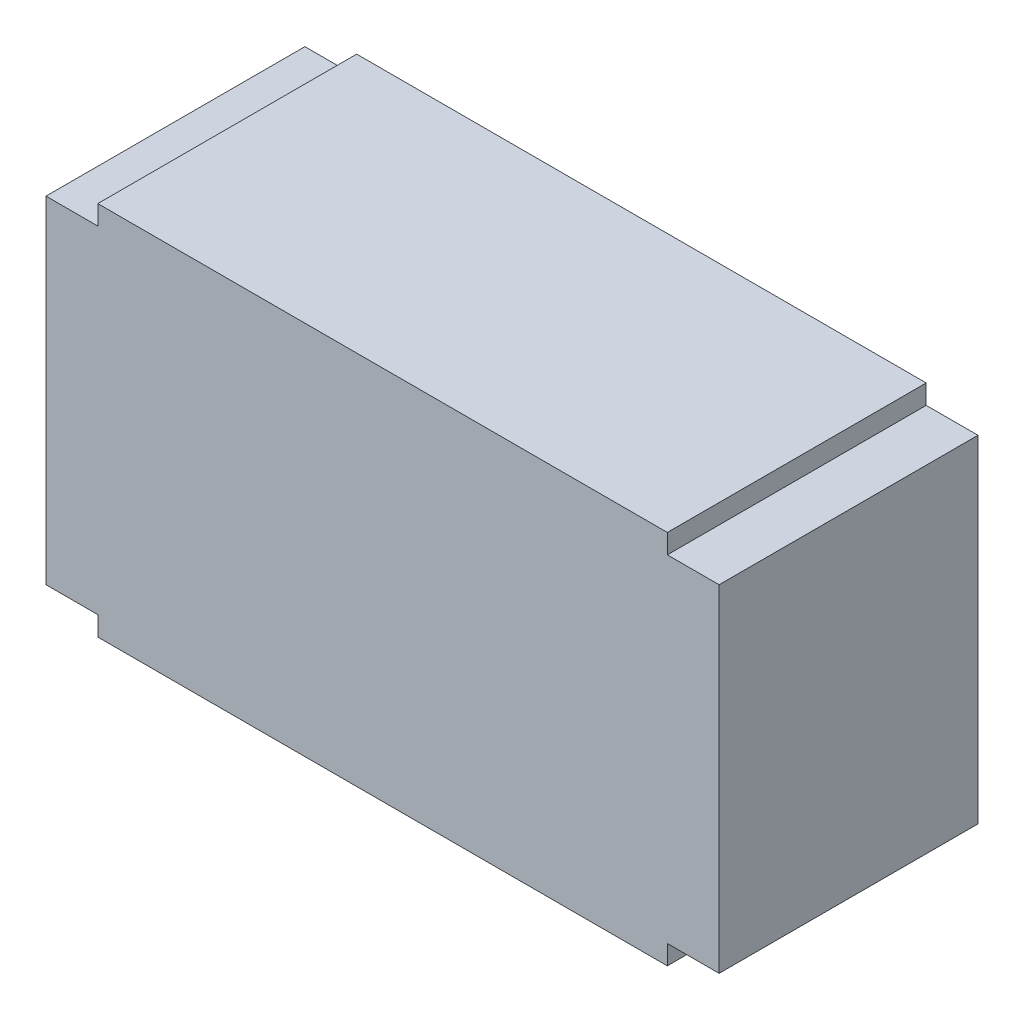
ISO-10303-21;
HEADER;
FILE_DESCRIPTION(('STEP AP214'),'2;1');
FILE_NAME('part.step','',(''),(''),'','','');
FILE_SCHEMA(('AUTOMOTIVE_DESIGN { 1 0 10303 214 1 1 1 1 }'));
ENDSEC;
DATA;
#1=APPLICATION_CONTEXT('core data for automotive mechanical design processes');
#2=APPLICATION_PROTOCOL_DEFINITION('international standard','automotive_design',2000,#1);
#3=PRODUCT_CONTEXT('',#1,'mechanical');
#4=PRODUCT('Part','Part','',(#3));
#5=PRODUCT_RELATED_PRODUCT_CATEGORY('part','',(#4));
#6=PRODUCT_DEFINITION_FORMATION('','',#4);
#7=PRODUCT_DEFINITION_CONTEXT('part definition',#1,'design');
#8=PRODUCT_DEFINITION('design','',#6,#7);
#9=PRODUCT_DEFINITION_SHAPE('','',#8);
#10=(LENGTH_UNIT() NAMED_UNIT(*) SI_UNIT(.MILLI.,.METRE.));
#11=(NAMED_UNIT(*) PLANE_ANGLE_UNIT() SI_UNIT($,.RADIAN.));
#12=(NAMED_UNIT(*) SI_UNIT($,.STERADIAN.) SOLID_ANGLE_UNIT());
#13=UNCERTAINTY_MEASURE_WITH_UNIT(LENGTH_MEASURE(1.E-05),#10,'distance_accuracy_value','');
#14=(GEOMETRIC_REPRESENTATION_CONTEXT(3) GLOBAL_UNCERTAINTY_ASSIGNED_CONTEXT((#13)) GLOBAL_UNIT_ASSIGNED_CONTEXT((#10,
#11,#12)) REPRESENTATION_CONTEXT('',''));
#15=CARTESIAN_POINT('',(0.,0.,0.));
#16=DIRECTION('',(0.,0.,1.));
#17=DIRECTION('',(1.,0.,0.));
#18=AXIS2_PLACEMENT_3D('',#15,#16,#17);
#19=CARTESIAN_POINT('',(-1.3,-0.65,1.));
#20=DIRECTION('',(1.,0.,0.));
#21=DIRECTION('',(0.,0.,-1.));
#22=AXIS2_PLACEMENT_3D('',#19,#20,#21);
#23=PLANE('',#22);
#24=DIRECTION('',(0.,-1.,0.));
#25=VECTOR('',#24,1.);
#26=CARTESIAN_POINT('',(-1.3,-0.65,0.));
#27=LINE('',#26,#25);
#28=CARTESIAN_POINT('',(-1.3,0.65,0.));
#29=VERTEX_POINT('',#28);
#30=CARTESIAN_POINT('',(-1.3,-0.65,0.));
#31=VERTEX_POINT('',#30);
#32=EDGE_CURVE('E154',#29,#31,#27,.T.);
#33=ORIENTED_EDGE('',*,*,#32,.T.);
#34=DIRECTION('',(0.,0.,-1.));
#35=VECTOR('',#34,1.);
#36=CARTESIAN_POINT('',(-1.3,-0.65,1.));
#37=LINE('',#36,#35);
#38=CARTESIAN_POINT('',(-1.3,-0.65,1.));
#39=VERTEX_POINT('',#38);
#40=EDGE_CURVE('E11',#39,#31,#37,.T.);
#41=ORIENTED_EDGE('',*,*,#40,.F.);
#42=DIRECTION('',(0.,-1.,0.));
#43=VECTOR('',#42,1.);
#44=CARTESIAN_POINT('',(-1.3,-0.65,1.));
#45=LINE('',#44,#43);
#46=CARTESIAN_POINT('',(-1.3,0.65,1.));
#47=VERTEX_POINT('',#46);
#48=EDGE_CURVE('E176',#47,#39,#45,.T.);
#49=ORIENTED_EDGE('',*,*,#48,.F.);
#50=DIRECTION('',(0.,0.,-1.));
#51=VECTOR('',#50,1.);
#52=CARTESIAN_POINT('',(-1.3,0.65,1.));
#53=LINE('',#52,#51);
#54=EDGE_CURVE('E150',#47,#29,#53,.T.);
#55=ORIENTED_EDGE('',*,*,#54,.T.);
#56=EDGE_LOOP('',(#33,#41,#49,#55));
#57=FACE_BOUND('',#56,.T.);
#58=ADVANCED_FACE('F34',(#57),#23,.F.);
#59=CARTESIAN_POINT('',(-1.1,-0.65,1.));
#60=DIRECTION('',(0.,1.,0.));
#61=DIRECTION('',(0.,0.,1.));
#62=AXIS2_PLACEMENT_3D('',#59,#60,#61);
#63=PLANE('',#62);
#64=DIRECTION('',(1.,0.,0.));
#65=VECTOR('',#64,1.);
#66=CARTESIAN_POINT('',(-1.1,-0.65,0.));
#67=LINE('',#66,#65);
#68=CARTESIAN_POINT('',(-1.1,-0.65,0.));
#69=VERTEX_POINT('',#68);
#70=EDGE_CURVE('E157',#31,#69,#67,.T.);
#71=ORIENTED_EDGE('',*,*,#70,.T.);
#72=DIRECTION('',(0.,0.,-1.));
#73=VECTOR('',#72,1.);
#74=CARTESIAN_POINT('',(-1.1,-0.65,1.));
#75=LINE('',#74,#73);
#76=CARTESIAN_POINT('',(-1.1,-0.65,1.));
#77=VERTEX_POINT('',#76);
#78=EDGE_CURVE('E42',#77,#69,#75,.T.);
#79=ORIENTED_EDGE('',*,*,#78,.F.);
#80=DIRECTION('',(1.,0.,0.));
#81=VECTOR('',#80,1.);
#82=CARTESIAN_POINT('',(-1.1,-0.65,1.));
#83=LINE('',#82,#81);
#84=EDGE_CURVE('E105',#39,#77,#83,.T.);
#85=ORIENTED_EDGE('',*,*,#84,.F.);
#86=ORIENTED_EDGE('',*,*,#40,.T.);
#87=EDGE_LOOP('',(#71,#79,#85,#86));
#88=FACE_BOUND('',#87,.T.);
#89=ADVANCED_FACE('F254',(#88),#63,.F.);
#90=CARTESIAN_POINT('',(-1.1,-0.725,1.));
#91=DIRECTION('',(1.,0.,0.));
#92=DIRECTION('',(0.,0.,-1.));
#93=AXIS2_PLACEMENT_3D('',#90,#91,#92);
#94=PLANE('',#93);
#95=DIRECTION('',(0.,-1.,0.));
#96=VECTOR('',#95,1.);
#97=CARTESIAN_POINT('',(-1.1,-0.725,0.));
#98=LINE('',#97,#96);
#99=CARTESIAN_POINT('',(-1.1,-0.725,0.));
#100=VERTEX_POINT('',#99);
#101=EDGE_CURVE('E159',#69,#100,#98,.T.);
#102=ORIENTED_EDGE('',*,*,#101,.T.);
#103=DIRECTION('',(0.,0.,-1.));
#104=VECTOR('',#103,1.);
#105=CARTESIAN_POINT('',(-1.1,-0.725,1.));
#106=LINE('',#105,#104);
#107=CARTESIAN_POINT('',(-1.1,-0.725,1.));
#108=VERTEX_POINT('',#107);
#109=EDGE_CURVE('E195',#108,#100,#106,.T.);
#110=ORIENTED_EDGE('',*,*,#109,.F.);
#111=DIRECTION('',(0.,-1.,0.));
#112=VECTOR('',#111,1.);
#113=CARTESIAN_POINT('',(-1.1,-0.725,1.));
#114=LINE('',#113,#112);
#115=EDGE_CURVE('E203',#77,#108,#114,.T.);
#116=ORIENTED_EDGE('',*,*,#115,.F.);
#117=ORIENTED_EDGE('',*,*,#78,.T.);
#118=EDGE_LOOP('',(#102,#110,#116,#117));
#119=FACE_BOUND('',#118,.T.);
#120=ADVANCED_FACE('F201',(#119),#94,.F.);
#121=CARTESIAN_POINT('',(1.1,-0.725,1.));
#122=DIRECTION('',(0.,1.,0.));
#123=DIRECTION('',(0.,0.,1.));
#124=AXIS2_PLACEMENT_3D('',#121,#122,#123);
#125=PLANE('',#124);
#126=DIRECTION('',(1.,0.,0.));
#127=VECTOR('',#126,1.);
#128=CARTESIAN_POINT('',(1.1,-0.725,0.));
#129=LINE('',#128,#127);
#130=CARTESIAN_POINT('',(1.1,-0.725,0.));
#131=VERTEX_POINT('',#130);
#132=EDGE_CURVE('E161',#100,#131,#129,.T.);
#133=ORIENTED_EDGE('',*,*,#132,.T.);
#134=DIRECTION('',(0.,0.,-1.));
#135=VECTOR('',#134,1.);
#136=CARTESIAN_POINT('',(1.1,-0.725,1.));
#137=LINE('',#136,#135);
#138=CARTESIAN_POINT('',(1.1,-0.725,1.));
#139=VERTEX_POINT('',#138);
#140=EDGE_CURVE('E192',#139,#131,#137,.T.);
#141=ORIENTED_EDGE('',*,*,#140,.F.);
#142=DIRECTION('',(1.,0.,0.));
#143=VECTOR('',#142,1.);
#144=CARTESIAN_POINT('',(1.1,-0.725,1.));
#145=LINE('',#144,#143);
#146=EDGE_CURVE('E221',#108,#139,#145,.T.);
#147=ORIENTED_EDGE('',*,*,#146,.F.);
#148=ORIENTED_EDGE('',*,*,#109,.T.);
#149=EDGE_LOOP('',(#133,#141,#147,#148));
#150=FACE_BOUND('',#149,.T.);
#151=ADVANCED_FACE('F212',(#150),#125,.F.);
#152=CARTESIAN_POINT('',(1.1,-0.65,1.));
#153=DIRECTION('',(-1.,0.,0.));
#154=DIRECTION('',(0.,0.,1.));
#155=AXIS2_PLACEMENT_3D('',#152,#153,#154);
#156=PLANE('',#155);
#157=DIRECTION('',(0.,1.,0.));
#158=VECTOR('',#157,1.);
#159=CARTESIAN_POINT('',(1.1,-0.65,0.));
#160=LINE('',#159,#158);
#161=CARTESIAN_POINT('',(1.1,-0.65,0.));
#162=VERTEX_POINT('',#161);
#163=EDGE_CURVE('E163',#131,#162,#160,.T.);
#164=ORIENTED_EDGE('',*,*,#163,.T.);
#165=DIRECTION('',(0.,0.,-1.));
#166=VECTOR('',#165,1.);
#167=CARTESIAN_POINT('',(1.1,-0.65,1.));
#168=LINE('',#167,#166);
#169=CARTESIAN_POINT('',(1.1,-0.65,1.));
#170=VERTEX_POINT('',#169);
#171=EDGE_CURVE('E189',#170,#162,#168,.T.);
#172=ORIENTED_EDGE('',*,*,#171,.F.);
#173=DIRECTION('',(0.,1.,0.));
#174=VECTOR('',#173,1.);
#175=CARTESIAN_POINT('',(1.1,-0.65,1.));
#176=LINE('',#175,#174);
#177=EDGE_CURVE('E218',#139,#170,#176,.T.);
#178=ORIENTED_EDGE('',*,*,#177,.F.);
#179=ORIENTED_EDGE('',*,*,#140,.T.);
#180=EDGE_LOOP('',(#164,#172,#178,#179));
#181=FACE_BOUND('',#180,.T.);
#182=ADVANCED_FACE('F216',(#181),#156,.F.);
#183=CARTESIAN_POINT('',(1.3,-0.65,1.));
#184=DIRECTION('',(0.,1.,0.));
#185=DIRECTION('',(0.,0.,1.));
#186=AXIS2_PLACEMENT_3D('',#183,#184,#185);
#187=PLANE('',#186);
#188=DIRECTION('',(1.,0.,0.));
#189=VECTOR('',#188,1.);
#190=CARTESIAN_POINT('',(1.3,-0.65,0.));
#191=LINE('',#190,#189);
#192=CARTESIAN_POINT('',(1.3,-0.65,0.));
#193=VERTEX_POINT('',#192);
#194=EDGE_CURVE('E165',#162,#193,#191,.T.);
#195=ORIENTED_EDGE('',*,*,#194,.T.);
#196=DIRECTION('',(0.,0.,-1.));
#197=VECTOR('',#196,1.);
#198=CARTESIAN_POINT('',(1.3,-0.65,1.));
#199=LINE('',#198,#197);
#200=CARTESIAN_POINT('',(1.3,-0.65,1.));
#201=VERTEX_POINT('',#200);
#202=EDGE_CURVE('E186',#201,#193,#199,.T.);
#203=ORIENTED_EDGE('',*,*,#202,.F.);
#204=DIRECTION('',(1.,0.,0.));
#205=VECTOR('',#204,1.);
#206=CARTESIAN_POINT('',(1.3,-0.65,1.));
#207=LINE('',#206,#205);
#208=EDGE_CURVE('E220',#170,#201,#207,.T.);
#209=ORIENTED_EDGE('',*,*,#208,.F.);
#210=ORIENTED_EDGE('',*,*,#171,.T.);
#211=EDGE_LOOP('',(#195,#203,#209,#210));
#212=FACE_BOUND('',#211,.T.);
#213=ADVANCED_FACE('F267',(#212),#187,.F.);
#214=CARTESIAN_POINT('',(1.3,0.65,1.));
#215=DIRECTION('',(-1.,0.,0.));
#216=DIRECTION('',(0.,0.,1.));
#217=AXIS2_PLACEMENT_3D('',#214,#215,#216);
#218=PLANE('',#217);
#219=DIRECTION('',(0.,1.,0.));
#220=VECTOR('',#219,1.);
#221=CARTESIAN_POINT('',(1.3,0.65,0.));
#222=LINE('',#221,#220);
#223=CARTESIAN_POINT('',(1.3,0.65,0.));
#224=VERTEX_POINT('',#223);
#225=EDGE_CURVE('E167',#193,#224,#222,.T.);
#226=ORIENTED_EDGE('',*,*,#225,.T.);
#227=DIRECTION('',(0.,0.,-1.));
#228=VECTOR('',#227,1.);
#229=CARTESIAN_POINT('',(1.3,0.65,1.));
#230=LINE('',#229,#228);
#231=CARTESIAN_POINT('',(1.3,0.65,1.));
#232=VERTEX_POINT('',#231);
#233=EDGE_CURVE('E183',#232,#224,#230,.T.);
#234=ORIENTED_EDGE('',*,*,#233,.F.);
#235=DIRECTION('',(0.,1.,0.));
#236=VECTOR('',#235,1.);
#237=CARTESIAN_POINT('',(1.3,0.65,1.));
#238=LINE('',#237,#236);
#239=EDGE_CURVE('E223',#201,#232,#238,.T.);
#240=ORIENTED_EDGE('',*,*,#239,.F.);
#241=ORIENTED_EDGE('',*,*,#202,.T.);
#242=EDGE_LOOP('',(#226,#234,#240,#241));
#243=FACE_BOUND('',#242,.T.);
#244=ADVANCED_FACE('F270',(#243),#218,.F.);
#245=CARTESIAN_POINT('',(1.1,0.65,1.));
#246=DIRECTION('',(0.,-1.,0.));
#247=DIRECTION('',(0.,0.,-1.));
#248=AXIS2_PLACEMENT_3D('',#245,#246,#247);
#249=PLANE('',#248);
#250=DIRECTION('',(-1.,0.,0.));
#251=VECTOR('',#250,1.);
#252=CARTESIAN_POINT('',(1.1,0.65,0.));
#253=LINE('',#252,#251);
#254=CARTESIAN_POINT('',(1.1,0.65,0.));
#255=VERTEX_POINT('',#254);
#256=EDGE_CURVE('E169',#224,#255,#253,.T.);
#257=ORIENTED_EDGE('',*,*,#256,.T.);
#258=DIRECTION('',(0.,0.,-1.));
#259=VECTOR('',#258,1.);
#260=CARTESIAN_POINT('',(1.1,0.65,1.));
#261=LINE('',#260,#259);
#262=CARTESIAN_POINT('',(1.1,0.65,1.));
#263=VERTEX_POINT('',#262);
#264=EDGE_CURVE('E180',#263,#255,#261,.T.);
#265=ORIENTED_EDGE('',*,*,#264,.F.);
#266=DIRECTION('',(-1.,0.,0.));
#267=VECTOR('',#266,1.);
#268=CARTESIAN_POINT('',(1.1,0.65,1.));
#269=LINE('',#268,#267);
#270=EDGE_CURVE('E229',#232,#263,#269,.T.);
#271=ORIENTED_EDGE('',*,*,#270,.F.);
#272=ORIENTED_EDGE('',*,*,#233,.T.);
#273=EDGE_LOOP('',(#257,#265,#271,#272));
#274=FACE_BOUND('',#273,.T.);
#275=ADVANCED_FACE('F235',(#274),#249,.F.);
#276=CARTESIAN_POINT('',(1.1,0.725,1.));
#277=DIRECTION('',(-1.,0.,0.));
#278=DIRECTION('',(0.,0.,1.));
#279=AXIS2_PLACEMENT_3D('',#276,#277,#278);
#280=PLANE('',#279);
#281=DIRECTION('',(0.,1.,0.));
#282=VECTOR('',#281,1.);
#283=CARTESIAN_POINT('',(1.1,0.725,0.));
#284=LINE('',#283,#282);
#285=CARTESIAN_POINT('',(1.1,0.725,0.));
#286=VERTEX_POINT('',#285);
#287=EDGE_CURVE('E171',#255,#286,#284,.T.);
#288=ORIENTED_EDGE('',*,*,#287,.T.);
#289=DIRECTION('',(0.,0.,-1.));
#290=VECTOR('',#289,1.);
#291=CARTESIAN_POINT('',(1.1,0.725,1.));
#292=LINE('',#291,#290);
#293=CARTESIAN_POINT('',(1.1,0.725,1.));
#294=VERTEX_POINT('',#293);
#295=EDGE_CURVE('E145',#294,#286,#292,.T.);
#296=ORIENTED_EDGE('',*,*,#295,.F.);
#297=DIRECTION('',(0.,1.,0.));
#298=VECTOR('',#297,1.);
#299=CARTESIAN_POINT('',(1.1,0.725,1.));
#300=LINE('',#299,#298);
#301=EDGE_CURVE('E136',#263,#294,#300,.T.);
#302=ORIENTED_EDGE('',*,*,#301,.F.);
#303=ORIENTED_EDGE('',*,*,#264,.T.);
#304=EDGE_LOOP('',(#288,#296,#302,#303));
#305=FACE_BOUND('',#304,.T.);
#306=ADVANCED_FACE('F239',(#305),#280,.F.);
#307=CARTESIAN_POINT('',(-1.1,0.725,1.));
#308=DIRECTION('',(0.,-1.,0.));
#309=DIRECTION('',(0.,0.,-1.));
#310=AXIS2_PLACEMENT_3D('',#307,#308,#309);
#311=PLANE('',#310);
#312=DIRECTION('',(-1.,0.,0.));
#313=VECTOR('',#312,1.);
#314=CARTESIAN_POINT('',(-1.1,0.725,0.));
#315=LINE('',#314,#313);
#316=CARTESIAN_POINT('',(-1.1,0.725,0.));
#317=VERTEX_POINT('',#316);
#318=EDGE_CURVE('E144',#286,#317,#315,.T.);
#319=ORIENTED_EDGE('',*,*,#318,.T.);
#320=DIRECTION('',(0.,0.,-1.));
#321=VECTOR('',#320,1.);
#322=CARTESIAN_POINT('',(-1.1,0.725,1.));
#323=LINE('',#322,#321);
#324=CARTESIAN_POINT('',(-1.1,0.725,1.));
#325=VERTEX_POINT('',#324);
#326=EDGE_CURVE('E141',#325,#317,#323,.T.);
#327=ORIENTED_EDGE('',*,*,#326,.F.);
#328=DIRECTION('',(-1.,0.,0.));
#329=VECTOR('',#328,1.);
#330=CARTESIAN_POINT('',(-1.1,0.725,1.));
#331=LINE('',#330,#329);
#332=EDGE_CURVE('E130',#294,#325,#331,.T.);
#333=ORIENTED_EDGE('',*,*,#332,.F.);
#334=ORIENTED_EDGE('',*,*,#295,.T.);
#335=EDGE_LOOP('',(#319,#327,#333,#334));
#336=FACE_BOUND('',#335,.T.);
#337=ADVANCED_FACE('F142',(#336),#311,.F.);
#338=CARTESIAN_POINT('',(-1.1,0.65,1.));
#339=DIRECTION('',(1.,0.,0.));
#340=DIRECTION('',(0.,0.,-1.));
#341=AXIS2_PLACEMENT_3D('',#338,#339,#340);
#342=PLANE('',#341);
#343=DIRECTION('',(0.,-1.,0.));
#344=VECTOR('',#343,1.);
#345=CARTESIAN_POINT('',(-1.1,0.65,0.));
#346=LINE('',#345,#344);
#347=CARTESIAN_POINT('',(-1.1,0.65,0.));
#348=VERTEX_POINT('',#347);
#349=EDGE_CURVE('E91',#317,#348,#346,.T.);
#350=ORIENTED_EDGE('',*,*,#349,.T.);
#351=DIRECTION('',(0.,0.,-1.));
#352=VECTOR('',#351,1.);
#353=CARTESIAN_POINT('',(-1.1,0.65,1.));
#354=LINE('',#353,#352);
#355=CARTESIAN_POINT('',(-1.1,0.65,1.));
#356=VERTEX_POINT('',#355);
#357=EDGE_CURVE('E146',#356,#348,#354,.T.);
#358=ORIENTED_EDGE('',*,*,#357,.F.);
#359=DIRECTION('',(0.,-1.,0.));
#360=VECTOR('',#359,1.);
#361=CARTESIAN_POINT('',(-1.1,0.65,1.));
#362=LINE('',#361,#360);
#363=EDGE_CURVE('E134',#325,#356,#362,.T.);
#364=ORIENTED_EDGE('',*,*,#363,.F.);
#365=ORIENTED_EDGE('',*,*,#326,.T.);
#366=EDGE_LOOP('',(#350,#358,#364,#365));
#367=FACE_BOUND('',#366,.T.);
#368=ADVANCED_FACE('F148',(#367),#342,.F.);
#369=CARTESIAN_POINT('',(-1.3,0.65,1.));
#370=DIRECTION('',(0.,-1.,0.));
#371=DIRECTION('',(0.,0.,-1.));
#372=AXIS2_PLACEMENT_3D('',#369,#370,#371);
#373=PLANE('',#372);
#374=DIRECTION('',(-1.,0.,0.));
#375=VECTOR('',#374,1.);
#376=CARTESIAN_POINT('',(-1.3,0.65,0.));
#377=LINE('',#376,#375);
#378=EDGE_CURVE('E97',#348,#29,#377,.T.);
#379=ORIENTED_EDGE('',*,*,#378,.T.);
#380=ORIENTED_EDGE('',*,*,#54,.F.);
#381=DIRECTION('',(-1.,0.,0.));
#382=VECTOR('',#381,1.);
#383=CARTESIAN_POINT('',(-1.3,0.65,1.));
#384=LINE('',#383,#382);
#385=EDGE_CURVE('E50',#356,#47,#384,.T.);
#386=ORIENTED_EDGE('',*,*,#385,.F.);
#387=ORIENTED_EDGE('',*,*,#357,.T.);
#388=EDGE_LOOP('',(#379,#380,#386,#387));
#389=FACE_BOUND('',#388,.T.);
#390=ADVANCED_FACE('F243',(#389),#373,.F.);
#391=CARTESIAN_POINT('',(0.,0.,1.));
#392=DIRECTION('',(0.,0.,-1.));
#393=DIRECTION('',(-1.,0.,0.));
#394=AXIS2_PLACEMENT_3D('',#391,#392,#393);
#395=PLANE('',#394);
#396=ORIENTED_EDGE('',*,*,#48,.T.);
#397=ORIENTED_EDGE('',*,*,#84,.T.);
#398=ORIENTED_EDGE('',*,*,#115,.T.);
#399=ORIENTED_EDGE('',*,*,#146,.T.);
#400=ORIENTED_EDGE('',*,*,#177,.T.);
#401=ORIENTED_EDGE('',*,*,#208,.T.);
#402=ORIENTED_EDGE('',*,*,#239,.T.);
#403=ORIENTED_EDGE('',*,*,#270,.T.);
#404=ORIENTED_EDGE('',*,*,#301,.T.);
#405=ORIENTED_EDGE('',*,*,#332,.T.);
#406=ORIENTED_EDGE('',*,*,#363,.T.);
#407=ORIENTED_EDGE('',*,*,#385,.T.);
#408=EDGE_LOOP('',(#396,#397,#398,#399,#400,#401,#402,#403,#404,#405,#406,#407));
#409=FACE_BOUND('',#408,.T.);
#410=ADVANCED_FACE('F132',(#409),#395,.F.);
#411=CARTESIAN_POINT('',(0.,0.,0.));
#412=DIRECTION('',(0.,0.,-1.));
#413=DIRECTION('',(-1.,0.,0.));
#414=AXIS2_PLACEMENT_3D('',#411,#412,#413);
#415=PLANE('',#414);
#416=ORIENTED_EDGE('',*,*,#32,.F.);
#417=ORIENTED_EDGE('',*,*,#378,.F.);
#418=ORIENTED_EDGE('',*,*,#349,.F.);
#419=ORIENTED_EDGE('',*,*,#318,.F.);
#420=ORIENTED_EDGE('',*,*,#287,.F.);
#421=ORIENTED_EDGE('',*,*,#256,.F.);
#422=ORIENTED_EDGE('',*,*,#225,.F.);
#423=ORIENTED_EDGE('',*,*,#194,.F.);
#424=ORIENTED_EDGE('',*,*,#163,.F.);
#425=ORIENTED_EDGE('',*,*,#132,.F.);
#426=ORIENTED_EDGE('',*,*,#101,.F.);
#427=ORIENTED_EDGE('',*,*,#70,.F.);
#428=EDGE_LOOP('',(#416,#417,#418,#419,#420,#421,#422,#423,#424,#425,#426,#427));
#429=FACE_BOUND('',#428,.T.);
#430=ADVANCED_FACE('F207',(#429),#415,.T.);
#431=CLOSED_SHELL('',(#58,#89,#120,#151,#182,#213,#244,#275,#306,#337,#368,#390,#410,#430));
#432=MANIFOLD_SOLID_BREP('B2',#431);
#433=ADVANCED_BREP_SHAPE_REPRESENTATION('',(#18,#432),#14);
#434=SHAPE_DEFINITION_REPRESENTATION(#9,#433);
ENDSEC;
END-ISO-10303-21;
